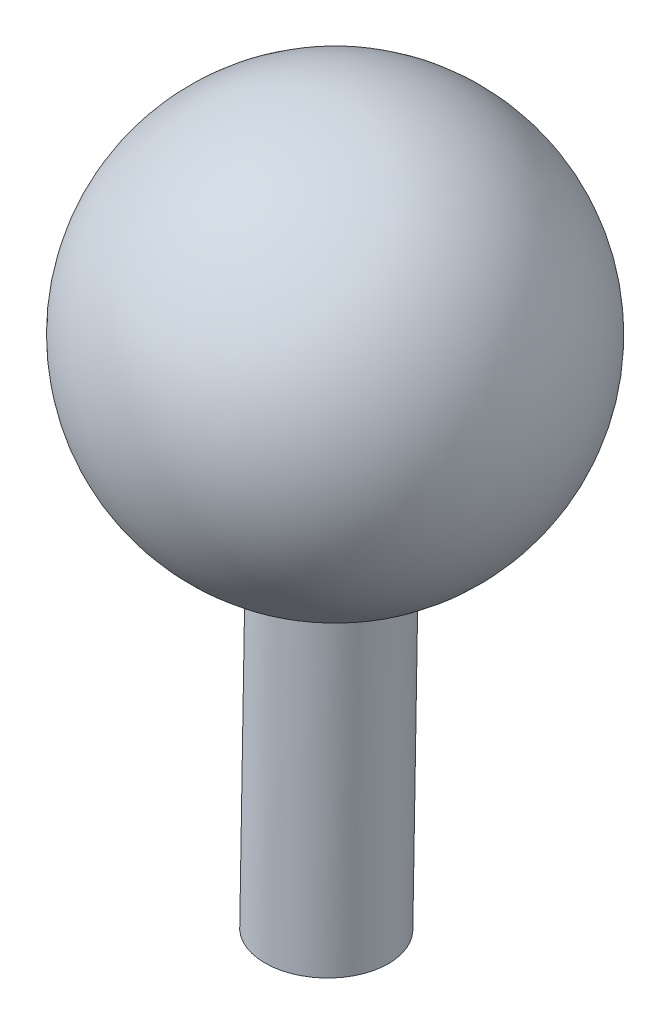
ISO-10303-21;
HEADER;
FILE_DESCRIPTION(('STEP AP214'),'2;1');
FILE_NAME('part.step','',(''),(''),'','','');
FILE_SCHEMA(('AUTOMOTIVE_DESIGN { 1 0 10303 214 1 1 1 1 }'));
ENDSEC;
DATA;
#1=APPLICATION_CONTEXT('core data for automotive mechanical design processes');
#2=APPLICATION_PROTOCOL_DEFINITION('international standard','automotive_design',2000,#1);
#3=PRODUCT_CONTEXT('',#1,'mechanical');
#4=PRODUCT('Part','Part','',(#3));
#5=PRODUCT_RELATED_PRODUCT_CATEGORY('part','',(#4));
#6=PRODUCT_DEFINITION_FORMATION('','',#4);
#7=PRODUCT_DEFINITION_CONTEXT('part definition',#1,'design');
#8=PRODUCT_DEFINITION('design','',#6,#7);
#9=PRODUCT_DEFINITION_SHAPE('','',#8);
#10=(LENGTH_UNIT() NAMED_UNIT(*) SI_UNIT(.MILLI.,.METRE.));
#11=(NAMED_UNIT(*) PLANE_ANGLE_UNIT() SI_UNIT($,.RADIAN.));
#12=(NAMED_UNIT(*) SI_UNIT($,.STERADIAN.) SOLID_ANGLE_UNIT());
#13=UNCERTAINTY_MEASURE_WITH_UNIT(LENGTH_MEASURE(1.E-05),#10,'distance_accuracy_value','');
#14=(GEOMETRIC_REPRESENTATION_CONTEXT(3) GLOBAL_UNCERTAINTY_ASSIGNED_CONTEXT((#13)) GLOBAL_UNIT_ASSIGNED_CONTEXT((#10,
#11,#12)) REPRESENTATION_CONTEXT('',''));
#15=CARTESIAN_POINT('',(0.,0.,0.));
#16=DIRECTION('',(0.,0.,1.));
#17=DIRECTION('',(1.,0.,0.));
#18=AXIS2_PLACEMENT_3D('',#15,#16,#17);
#19=CARTESIAN_POINT('',(111.05852848142,3.25792857913204,594.89332454061));
#20=DIRECTION('',(-1.,0.,0.));
#21=DIRECTION('',(0.,-0.0174524064372834,-0.999847695156391));
#22=AXIS2_PLACEMENT_3D('',#19,#20,#21);
#23=SPHERICAL_SURFACE('',#22,20.);
#24=CARTESIAN_POINT('',(111.05852848142,3.25792857913204,594.89332454061));
#25=DIRECTION('',(0.,0.999847695156391,-0.017452406437283));
#26=DIRECTION('',(0.,0.017452406437283,0.999847695156391));
#27=AXIS2_PLACEMENT_3D('',#24,#25,#26);
#28=SPHERICAL_SURFACE('',#27,20.);
#29=CARTESIAN_POINT('',(111.05852848142,-15.8179496579892,595.226295233802));
#30=DIRECTION('',(0.,0.999847695156391,-0.017452406437283));
#31=DIRECTION('',(0.,0.017452406437283,0.999847695156391));
#32=AXIS2_PLACEMENT_3D('',#29,#30,#31);
#33=CIRCLE('',#32,6.);
#34=CARTESIAN_POINT('',(111.05852848142,-15.7132352193655,601.225381404741));
#35=VERTEX_POINT('',#34);
#36=EDGE_CURVE('E10',#35,#35,#33,.F.);
#37=ORIENTED_EDGE('',*,*,#36,.F.);
#38=EDGE_LOOP('',(#37));
#39=FACE_BOUND('',#38,.T.);
#40=ADVANCED_FACE('F39',(#39),#28,.T.);
#41=CARTESIAN_POINT('',(111.05852848142,-46.7344561786875,595.765944862475));
#42=DIRECTION('',(0.,0.999847695156391,-0.0174524064372834));
#43=DIRECTION('',(0.,0.0174524064372834,0.999847695156391));
#44=AXIS2_PLACEMENT_3D('',#41,#42,#43);
#45=CYLINDRICAL_SURFACE('',#44,6.);
#46=ORIENTED_EDGE('',*,*,#36,.T.);
#47=EDGE_LOOP('',(#46));
#48=FACE_BOUND('',#47,.T.);
#49=CARTESIAN_POINT('',(111.05852848142,-46.7344561786875,595.765944862475));
#50=DIRECTION('',(0.,0.999847695156391,-0.0174524064372834));
#51=DIRECTION('',(0.,0.0174524064372834,0.999847695156391));
#52=AXIS2_PLACEMENT_3D('',#49,#50,#51);
#53=CIRCLE('',#52,6.);
#54=CARTESIAN_POINT('',(111.05852848142,-46.6297417400638,601.765031033413));
#55=VERTEX_POINT('',#54);
#56=EDGE_CURVE('E45',#55,#55,#53,.T.);
#57=ORIENTED_EDGE('',*,*,#56,.T.);
#58=EDGE_LOOP('',(#57));
#59=FACE_BOUND('',#58,.T.);
#60=ADVANCED_FACE('F51',(#48,#59),#45,.T.);
#61=CARTESIAN_POINT('',(111.05852848142,-46.7344561786875,595.765944862475));
#62=DIRECTION('',(0.,0.999847695156391,-0.0174524064372834));
#63=DIRECTION('',(0.,0.0174524064372834,0.999847695156391));
#64=AXIS2_PLACEMENT_3D('',#61,#62,#63);
#65=PLANE('',#64);
#66=ORIENTED_EDGE('',*,*,#56,.F.);
#67=EDGE_LOOP('',(#66));
#68=FACE_BOUND('',#67,.T.);
#69=ADVANCED_FACE('F53',(#68),#65,.F.);
#70=CLOSED_SHELL('',(#40,#60,#69));
#71=MANIFOLD_SOLID_BREP('B2',#70);
#72=ADVANCED_BREP_SHAPE_REPRESENTATION('',(#18,#71),#14);
#73=SHAPE_DEFINITION_REPRESENTATION(#9,#72);
ENDSEC;
END-ISO-10303-21;
